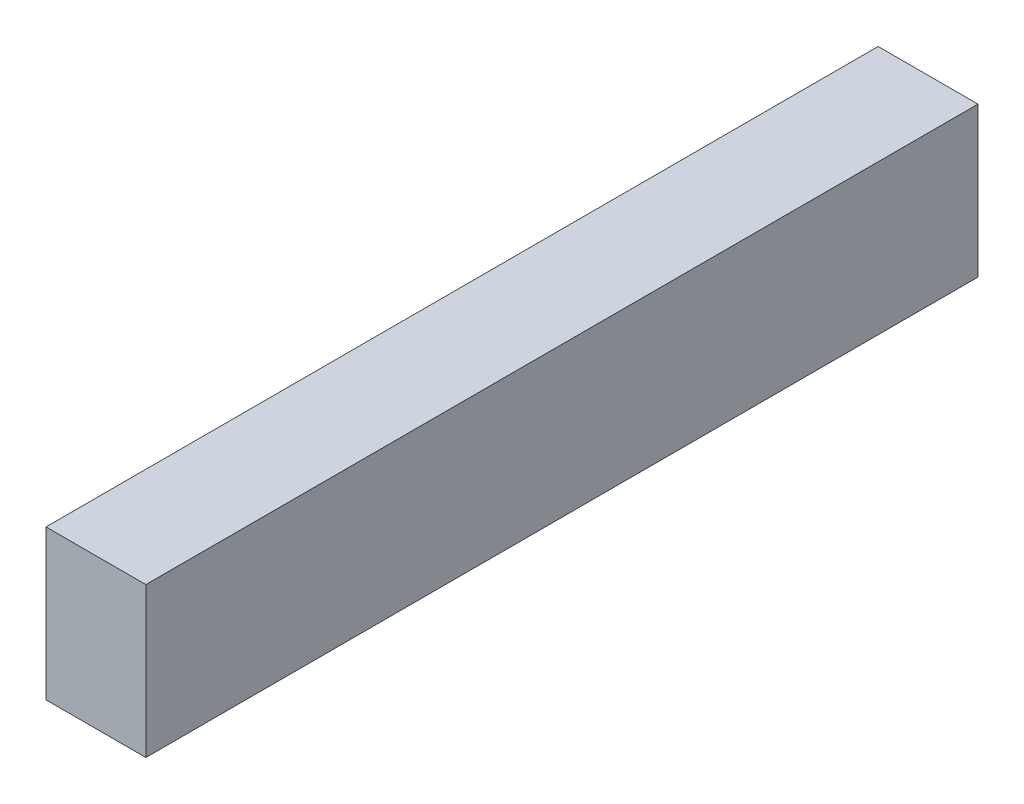
ISO-10303-21;
HEADER;
FILE_DESCRIPTION(('STEP AP214'),'2;1');
FILE_NAME('part.step','',(''),(''),'','','');
FILE_SCHEMA(('AUTOMOTIVE_DESIGN { 1 0 10303 214 1 1 1 1 }'));
ENDSEC;
DATA;
#1=APPLICATION_CONTEXT('core data for automotive mechanical design processes');
#2=APPLICATION_PROTOCOL_DEFINITION('international standard','automotive_design',2000,#1);
#3=PRODUCT_CONTEXT('',#1,'mechanical');
#4=PRODUCT('Part','Part','',(#3));
#5=PRODUCT_RELATED_PRODUCT_CATEGORY('part','',(#4));
#6=PRODUCT_DEFINITION_FORMATION('','',#4);
#7=PRODUCT_DEFINITION_CONTEXT('part definition',#1,'design');
#8=PRODUCT_DEFINITION('design','',#6,#7);
#9=PRODUCT_DEFINITION_SHAPE('','',#8);
#10=(LENGTH_UNIT() NAMED_UNIT(*) SI_UNIT(.MILLI.,.METRE.));
#11=(NAMED_UNIT(*) PLANE_ANGLE_UNIT() SI_UNIT($,.RADIAN.));
#12=(NAMED_UNIT(*) SI_UNIT($,.STERADIAN.) SOLID_ANGLE_UNIT());
#13=UNCERTAINTY_MEASURE_WITH_UNIT(LENGTH_MEASURE(1.E-05),#10,'distance_accuracy_value','');
#14=(GEOMETRIC_REPRESENTATION_CONTEXT(3) GLOBAL_UNCERTAINTY_ASSIGNED_CONTEXT((#13)) GLOBAL_UNIT_ASSIGNED_CONTEXT((#10,
#11,#12)) REPRESENTATION_CONTEXT('',''));
#15=CARTESIAN_POINT('',(0.,0.,0.));
#16=DIRECTION('',(0.,0.,1.));
#17=DIRECTION('',(1.,0.,0.));
#18=AXIS2_PLACEMENT_3D('',#15,#16,#17);
#19=CARTESIAN_POINT('',(-19.05,0.,-317.5));
#20=DIRECTION('',(-1.,0.,0.));
#21=DIRECTION('',(0.,-1.,0.));
#22=AXIS2_PLACEMENT_3D('',#19,#20,#21);
#23=PLANE('',#22);
#24=DIRECTION('',(0.,-1.,0.));
#25=VECTOR('',#24,1.);
#26=CARTESIAN_POINT('',(-19.05,0.,0.));
#27=LINE('',#26,#25);
#28=CARTESIAN_POINT('',(-19.05,0.,0.));
#29=VERTEX_POINT('',#28);
#30=CARTESIAN_POINT('',(-19.05,-57.15,0.));
#31=VERTEX_POINT('',#30);
#32=EDGE_CURVE('E70',#29,#31,#27,.T.);
#33=ORIENTED_EDGE('',*,*,#32,.F.);
#34=DIRECTION('',(0.,0.,1.));
#35=VECTOR('',#34,1.);
#36=CARTESIAN_POINT('',(-19.05,0.,-317.5));
#37=LINE('',#36,#35);
#38=CARTESIAN_POINT('',(-19.05,0.,-317.5));
#39=VERTEX_POINT('',#38);
#40=EDGE_CURVE('E11',#39,#29,#37,.T.);
#41=ORIENTED_EDGE('',*,*,#40,.F.);
#42=DIRECTION('',(0.,-1.,0.));
#43=VECTOR('',#42,1.);
#44=CARTESIAN_POINT('',(-19.05,0.,-317.5));
#45=LINE('',#44,#43);
#46=CARTESIAN_POINT('',(-19.0500000000001,-57.15,-317.5));
#47=VERTEX_POINT('',#46);
#48=EDGE_CURVE('E72',#39,#47,#45,.T.);
#49=ORIENTED_EDGE('',*,*,#48,.T.);
#50=DIRECTION('',(0.,0.,1.));
#51=VECTOR('',#50,1.);
#52=CARTESIAN_POINT('',(-19.0500000000001,-57.15,-317.5));
#53=LINE('',#52,#51);
#54=EDGE_CURVE('E33',#47,#31,#53,.T.);
#55=ORIENTED_EDGE('',*,*,#54,.T.);
#56=EDGE_LOOP('',(#33,#41,#49,#55));
#57=FACE_BOUND('',#56,.T.);
#58=ADVANCED_FACE('F30',(#57),#23,.T.);
#59=CARTESIAN_POINT('',(-19.05,0.,-317.5));
#60=DIRECTION('',(0.,1.,0.));
#61=DIRECTION('',(0.,0.,1.));
#62=AXIS2_PLACEMENT_3D('',#59,#60,#61);
#63=PLANE('',#62);
#64=DIRECTION('',(-1.,0.,0.));
#65=VECTOR('',#64,1.);
#66=CARTESIAN_POINT('',(-19.05,0.,0.));
#67=LINE('',#66,#65);
#68=CARTESIAN_POINT('',(19.05,0.,0.));
#69=VERTEX_POINT('',#68);
#70=EDGE_CURVE('E87',#69,#29,#67,.T.);
#71=ORIENTED_EDGE('',*,*,#70,.F.);
#72=DIRECTION('',(0.,0.,1.));
#73=VECTOR('',#72,1.);
#74=CARTESIAN_POINT('',(19.05,0.,-317.5));
#75=LINE('',#74,#73);
#76=CARTESIAN_POINT('',(19.05,0.,-317.5));
#77=VERTEX_POINT('',#76);
#78=EDGE_CURVE('E38',#77,#69,#75,.T.);
#79=ORIENTED_EDGE('',*,*,#78,.F.);
#80=DIRECTION('',(-1.,0.,0.));
#81=VECTOR('',#80,1.);
#82=CARTESIAN_POINT('',(-19.05,0.,-317.5));
#83=LINE('',#82,#81);
#84=EDGE_CURVE('E77',#77,#39,#83,.T.);
#85=ORIENTED_EDGE('',*,*,#84,.T.);
#86=ORIENTED_EDGE('',*,*,#40,.T.);
#87=EDGE_LOOP('',(#71,#79,#85,#86));
#88=FACE_BOUND('',#87,.T.);
#89=ADVANCED_FACE('F102',(#88),#63,.T.);
#90=CARTESIAN_POINT('',(19.05,0.,-317.5));
#91=DIRECTION('',(1.,0.,0.));
#92=DIRECTION('',(0.,1.,0.));
#93=AXIS2_PLACEMENT_3D('',#90,#91,#92);
#94=PLANE('',#93);
#95=DIRECTION('',(0.,1.,0.));
#96=VECTOR('',#95,1.);
#97=CARTESIAN_POINT('',(19.05,0.,0.));
#98=LINE('',#97,#96);
#99=CARTESIAN_POINT('',(19.05,-57.15,0.));
#100=VERTEX_POINT('',#99);
#101=EDGE_CURVE('E84',#100,#69,#98,.T.);
#102=ORIENTED_EDGE('',*,*,#101,.F.);
#103=DIRECTION('',(0.,0.,1.));
#104=VECTOR('',#103,1.);
#105=CARTESIAN_POINT('',(19.05,-57.15,-317.5));
#106=LINE('',#105,#104);
#107=CARTESIAN_POINT('',(19.05,-57.15,-317.5));
#108=VERTEX_POINT('',#107);
#109=EDGE_CURVE('E76',#108,#100,#106,.T.);
#110=ORIENTED_EDGE('',*,*,#109,.F.);
#111=DIRECTION('',(0.,1.,0.));
#112=VECTOR('',#111,1.);
#113=CARTESIAN_POINT('',(19.05,0.,-317.5));
#114=LINE('',#113,#112);
#115=EDGE_CURVE('E95',#108,#77,#114,.T.);
#116=ORIENTED_EDGE('',*,*,#115,.T.);
#117=ORIENTED_EDGE('',*,*,#78,.T.);
#118=EDGE_LOOP('',(#102,#110,#116,#117));
#119=FACE_BOUND('',#118,.T.);
#120=ADVANCED_FACE('F99',(#119),#94,.T.);
#121=CARTESIAN_POINT('',(-19.0500000000001,-57.15,-317.5));
#122=DIRECTION('',(0.,-1.,0.));
#123=DIRECTION('',(0.,0.,-1.));
#124=AXIS2_PLACEMENT_3D('',#121,#122,#123);
#125=PLANE('',#124);
#126=DIRECTION('',(1.,0.,0.));
#127=VECTOR('',#126,1.);
#128=CARTESIAN_POINT('',(-19.05,-57.15,0.));
#129=LINE('',#128,#127);
#130=EDGE_CURVE('E79',#31,#100,#129,.T.);
#131=ORIENTED_EDGE('',*,*,#130,.F.);
#132=ORIENTED_EDGE('',*,*,#54,.F.);
#133=DIRECTION('',(1.,0.,0.));
#134=VECTOR('',#133,1.);
#135=CARTESIAN_POINT('',(-19.0500000000001,-57.15,-317.5));
#136=LINE('',#135,#134);
#137=EDGE_CURVE('E93',#47,#108,#136,.T.);
#138=ORIENTED_EDGE('',*,*,#137,.T.);
#139=ORIENTED_EDGE('',*,*,#109,.T.);
#140=EDGE_LOOP('',(#131,#132,#138,#139));
#141=FACE_BOUND('',#140,.T.);
#142=ADVANCED_FACE('F80',(#141),#125,.T.);
#143=CARTESIAN_POINT('',(-19.05,0.,-317.5));
#144=DIRECTION('',(0.,0.,1.));
#145=DIRECTION('',(1.,0.,0.));
#146=AXIS2_PLACEMENT_3D('',#143,#144,#145);
#147=PLANE('',#146);
#148=ORIENTED_EDGE('',*,*,#48,.F.);
#149=ORIENTED_EDGE('',*,*,#84,.F.);
#150=ORIENTED_EDGE('',*,*,#115,.F.);
#151=ORIENTED_EDGE('',*,*,#137,.F.);
#152=EDGE_LOOP('',(#148,#149,#150,#151));
#153=FACE_BOUND('',#152,.T.);
#154=ADVANCED_FACE('F104',(#153),#147,.F.);
#155=CARTESIAN_POINT('',(-19.05,0.,0.));
#156=DIRECTION('',(0.,0.,1.));
#157=DIRECTION('',(1.,0.,0.));
#158=AXIS2_PLACEMENT_3D('',#155,#156,#157);
#159=PLANE('',#158);
#160=ORIENTED_EDGE('',*,*,#32,.T.);
#161=ORIENTED_EDGE('',*,*,#130,.T.);
#162=ORIENTED_EDGE('',*,*,#101,.T.);
#163=ORIENTED_EDGE('',*,*,#70,.T.);
#164=EDGE_LOOP('',(#160,#161,#162,#163));
#165=FACE_BOUND('',#164,.T.);
#166=ADVANCED_FACE('F86',(#165),#159,.T.);
#167=CLOSED_SHELL('',(#58,#89,#120,#142,#154,#166));
#168=MANIFOLD_SOLID_BREP('B2',#167);
#169=ADVANCED_BREP_SHAPE_REPRESENTATION('',(#18,#168),#14);
#170=SHAPE_DEFINITION_REPRESENTATION(#9,#169);
ENDSEC;
END-ISO-10303-21;
